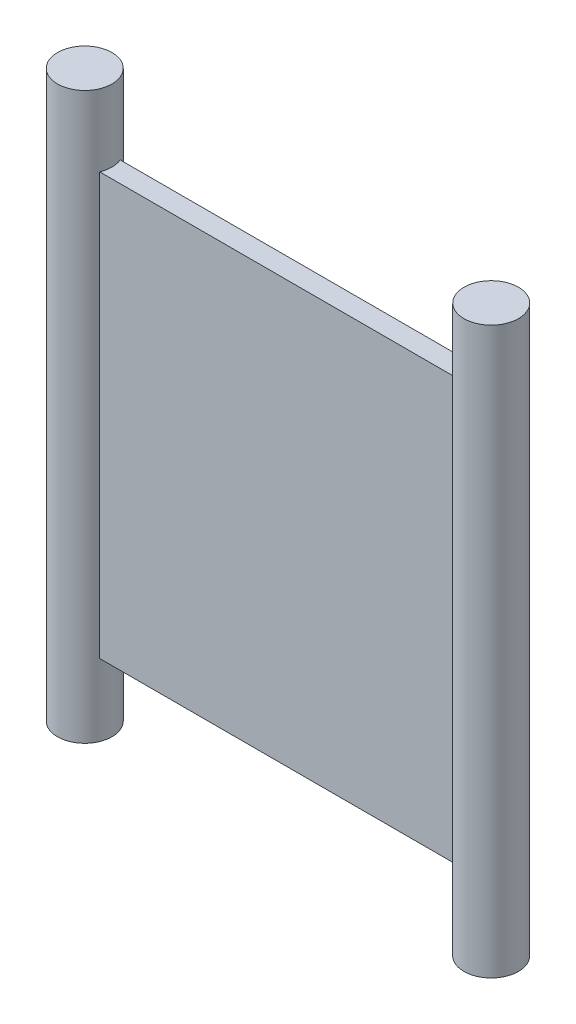
ISO-10303-21;
HEADER;
FILE_DESCRIPTION(('STEP AP214'),'2;1');
FILE_NAME('part.step','',(''),(''),'','','');
FILE_SCHEMA(('AUTOMOTIVE_DESIGN { 1 0 10303 214 1 1 1 1 }'));
ENDSEC;
DATA;
#1=APPLICATION_CONTEXT('core data for automotive mechanical design processes');
#2=APPLICATION_PROTOCOL_DEFINITION('international standard','automotive_design',2000,#1);
#3=PRODUCT_CONTEXT('',#1,'mechanical');
#4=PRODUCT('Part','Part','',(#3));
#5=PRODUCT_RELATED_PRODUCT_CATEGORY('part','',(#4));
#6=PRODUCT_DEFINITION_FORMATION('','',#4);
#7=PRODUCT_DEFINITION_CONTEXT('part definition',#1,'design');
#8=PRODUCT_DEFINITION('design','',#6,#7);
#9=PRODUCT_DEFINITION_SHAPE('','',#8);
#10=(LENGTH_UNIT() NAMED_UNIT(*) SI_UNIT(.MILLI.,.METRE.));
#11=(NAMED_UNIT(*) PLANE_ANGLE_UNIT() SI_UNIT($,.RADIAN.));
#12=(NAMED_UNIT(*) SI_UNIT($,.STERADIAN.) SOLID_ANGLE_UNIT());
#13=UNCERTAINTY_MEASURE_WITH_UNIT(LENGTH_MEASURE(1.E-05),#10,'distance_accuracy_value','');
#14=(GEOMETRIC_REPRESENTATION_CONTEXT(3) GLOBAL_UNCERTAINTY_ASSIGNED_CONTEXT((#13)) GLOBAL_UNIT_ASSIGNED_CONTEXT((#10,
#11,#12)) REPRESENTATION_CONTEXT('',''));
#15=CARTESIAN_POINT('',(0.,0.,0.));
#16=DIRECTION('',(0.,0.,1.));
#17=DIRECTION('',(1.,0.,0.));
#18=AXIS2_PLACEMENT_3D('',#15,#16,#17);
#19=CARTESIAN_POINT('',(9.885,20.5,0.499999999999999));
#20=DIRECTION('',(0.,0.,-1.));
#21=DIRECTION('',(-1.,0.,0.));
#22=AXIS2_PLACEMENT_3D('',#19,#20,#21);
#23=PLANE('',#22);
#24=DIRECTION('',(0.,-1.,0.));
#25=VECTOR('',#24,1.);
#26=CARTESIAN_POINT('',(8.6579608808192,24.,0.499999999999999));
#27=LINE('',#26,#25);
#28=CARTESIAN_POINT('',(8.6579608808192,20.5,0.499999999999999));
#29=VERTEX_POINT('',#28);
#30=CARTESIAN_POINT('',(8.6579608808192,0.,0.499999999999999));
#31=VERTEX_POINT('',#30);
#32=EDGE_CURVE('E53',#29,#31,#27,.T.);
#33=ORIENTED_EDGE('',*,*,#32,.F.);
#34=DIRECTION('',(1.,0.,0.));
#35=VECTOR('',#34,1.);
#36=CARTESIAN_POINT('',(9.885,20.5,0.499999999999999));
#37=LINE('',#36,#35);
#38=CARTESIAN_POINT('',(-8.65796088081919,20.5,0.500000000000001));
#39=VERTEX_POINT('',#38);
#40=EDGE_CURVE('E90',#39,#29,#37,.T.);
#41=ORIENTED_EDGE('',*,*,#40,.F.);
#42=DIRECTION('',(0.,-1.,0.));
#43=VECTOR('',#42,1.);
#44=CARTESIAN_POINT('',(-8.65796088081919,24.,0.500000000000001));
#45=LINE('',#44,#43);
#46=CARTESIAN_POINT('',(-8.65796088081919,0.,0.500000000000001));
#47=VERTEX_POINT('',#46);
#48=EDGE_CURVE('E103',#47,#39,#45,.F.);
#49=ORIENTED_EDGE('',*,*,#48,.F.);
#50=DIRECTION('',(1.,0.,0.));
#51=VECTOR('',#50,1.);
#52=CARTESIAN_POINT('',(9.885,0.,0.499999999999999));
#53=LINE('',#52,#51);
#54=EDGE_CURVE('E91',#47,#31,#53,.T.);
#55=ORIENTED_EDGE('',*,*,#54,.T.);
#56=EDGE_LOOP('',(#33,#41,#49,#55));
#57=FACE_BOUND('',#56,.T.);
#58=ADVANCED_FACE('F39',(#57),#23,.F.);
#59=CARTESIAN_POINT('',(9.885,20.5,-0.500000000000001));
#60=DIRECTION('',(0.,0.,1.));
#61=DIRECTION('',(1.,0.,0.));
#62=AXIS2_PLACEMENT_3D('',#59,#60,#61);
#63=PLANE('',#62);
#64=DIRECTION('',(0.,-1.,0.));
#65=VECTOR('',#64,1.);
#66=CARTESIAN_POINT('',(8.6579608808192,24.,-0.500000000000001));
#67=LINE('',#66,#65);
#68=CARTESIAN_POINT('',(8.6579608808192,0.,-0.500000000000001));
#69=VERTEX_POINT('',#68);
#70=CARTESIAN_POINT('',(8.6579608808192,20.5,-0.500000000000001));
#71=VERTEX_POINT('',#70);
#72=EDGE_CURVE('E78',#69,#71,#67,.F.);
#73=ORIENTED_EDGE('',*,*,#72,.F.);
#74=DIRECTION('',(-1.,0.,0.));
#75=VECTOR('',#74,1.);
#76=CARTESIAN_POINT('',(9.885,0.,-0.500000000000001));
#77=LINE('',#76,#75);
#78=CARTESIAN_POINT('',(-8.65796088081919,0.,-0.499999999999999));
#79=VERTEX_POINT('',#78);
#80=EDGE_CURVE('E60',#69,#79,#77,.T.);
#81=ORIENTED_EDGE('',*,*,#80,.T.);
#82=DIRECTION('',(0.,-1.,0.));
#83=VECTOR('',#82,1.);
#84=CARTESIAN_POINT('',(-8.65796088081919,24.,-0.499999999999999));
#85=LINE('',#84,#83);
#86=CARTESIAN_POINT('',(-8.65796088081919,20.5,-0.499999999999999));
#87=VERTEX_POINT('',#86);
#88=EDGE_CURVE('E105',#87,#79,#85,.T.);
#89=ORIENTED_EDGE('',*,*,#88,.F.);
#90=DIRECTION('',(-1.,0.,0.));
#91=VECTOR('',#90,1.);
#92=CARTESIAN_POINT('',(9.885,20.5,-0.500000000000001));
#93=LINE('',#92,#91);
#94=EDGE_CURVE('E85',#71,#87,#93,.T.);
#95=ORIENTED_EDGE('',*,*,#94,.F.);
#96=EDGE_LOOP('',(#73,#81,#89,#95));
#97=FACE_BOUND('',#96,.T.);
#98=ADVANCED_FACE('F84',(#97),#63,.F.);
#99=CARTESIAN_POINT('',(-9.885,24.,0.));
#100=DIRECTION('',(0.,-1.,0.));
#101=DIRECTION('',(0.,0.,-1.));
#102=AXIS2_PLACEMENT_3D('',#99,#100,#101);
#103=CYLINDRICAL_SURFACE('',#102,1.325);
#104=CARTESIAN_POINT('',(-9.885,24.,0.));
#105=DIRECTION('',(0.,1.,0.));
#106=DIRECTION('',(0.,0.,1.));
#107=AXIS2_PLACEMENT_3D('',#104,#105,#106);
#108=CIRCLE('',#107,1.325);
#109=CARTESIAN_POINT('',(-9.885,24.,1.325));
#110=VERTEX_POINT('',#109);
#111=EDGE_CURVE('E107',#110,#110,#108,.T.);
#112=ORIENTED_EDGE('',*,*,#111,.F.);
#113=EDGE_LOOP('',(#112));
#114=FACE_BOUND('',#113,.T.);
#115=CARTESIAN_POINT('',(-9.885,-3.5,0.));
#116=DIRECTION('',(0.,1.,0.));
#117=DIRECTION('',(0.,0.,1.));
#118=AXIS2_PLACEMENT_3D('',#115,#116,#117);
#119=CIRCLE('',#118,1.325);
#120=CARTESIAN_POINT('',(-9.885,-3.5,1.325));
#121=VERTEX_POINT('',#120);
#122=EDGE_CURVE('E108',#121,#121,#119,.T.);
#123=ORIENTED_EDGE('',*,*,#122,.T.);
#124=EDGE_LOOP('',(#123));
#125=FACE_BOUND('',#124,.T.);
#126=ORIENTED_EDGE('',*,*,#48,.T.);
#127=CARTESIAN_POINT('',(-9.885,20.5,0.));
#128=DIRECTION('',(0.,-1.,0.));
#129=DIRECTION('',(0.,0.,-1.));
#130=AXIS2_PLACEMENT_3D('',#127,#128,#129);
#131=CIRCLE('',#130,1.325);
#132=EDGE_CURVE('E95',#39,#87,#131,.F.);
#133=ORIENTED_EDGE('',*,*,#132,.T.);
#134=ORIENTED_EDGE('',*,*,#88,.T.);
#135=CARTESIAN_POINT('',(-9.885,0.,0.));
#136=DIRECTION('',(0.,-1.,0.));
#137=DIRECTION('',(0.,0.,-1.));
#138=AXIS2_PLACEMENT_3D('',#135,#136,#137);
#139=CIRCLE('',#138,1.325);
#140=EDGE_CURVE('E46',#47,#79,#139,.F.);
#141=ORIENTED_EDGE('',*,*,#140,.F.);
#142=EDGE_LOOP('',(#126,#133,#134,#141));
#143=FACE_BOUND('',#142,.T.);
#144=ADVANCED_FACE('F138',(#114,#125,#143),#103,.T.);
#145=CARTESIAN_POINT('',(-9.885,24.,0.));
#146=DIRECTION('',(0.,1.,0.));
#147=DIRECTION('',(0.,0.,1.));
#148=AXIS2_PLACEMENT_3D('',#145,#146,#147);
#149=PLANE('',#148);
#150=ORIENTED_EDGE('',*,*,#111,.T.);
#151=EDGE_LOOP('',(#150));
#152=FACE_BOUND('',#151,.T.);
#153=ADVANCED_FACE('F144',(#152),#149,.T.);
#154=CARTESIAN_POINT('',(-9.885,-3.5,0.));
#155=DIRECTION('',(0.,1.,0.));
#156=DIRECTION('',(0.,0.,1.));
#157=AXIS2_PLACEMENT_3D('',#154,#155,#156);
#158=PLANE('',#157);
#159=ORIENTED_EDGE('',*,*,#122,.F.);
#160=EDGE_LOOP('',(#159));
#161=FACE_BOUND('',#160,.T.);
#162=ADVANCED_FACE('F150',(#161),#158,.F.);
#163=CARTESIAN_POINT('',(0.,20.5,0.));
#164=DIRECTION('',(0.,-1.,0.));
#165=DIRECTION('',(0.,0.,-1.));
#166=AXIS2_PLACEMENT_3D('',#163,#164,#165);
#167=PLANE('',#166);
#168=CARTESIAN_POINT('',(9.885,20.5,0.));
#169=DIRECTION('',(0.,-1.,0.));
#170=DIRECTION('',(0.,0.,-1.));
#171=AXIS2_PLACEMENT_3D('',#168,#169,#170);
#172=CIRCLE('',#171,1.325);
#173=EDGE_CURVE('E111',#71,#29,#172,.F.);
#174=ORIENTED_EDGE('',*,*,#173,.F.);
#175=ORIENTED_EDGE('',*,*,#94,.T.);
#176=ORIENTED_EDGE('',*,*,#132,.F.);
#177=ORIENTED_EDGE('',*,*,#40,.T.);
#178=EDGE_LOOP('',(#174,#175,#176,#177));
#179=FACE_BOUND('',#178,.T.);
#180=ADVANCED_FACE('F141',(#179),#167,.F.);
#181=CARTESIAN_POINT('',(0.,0.,0.));
#182=DIRECTION('',(0.,-1.,0.));
#183=DIRECTION('',(0.,0.,-1.));
#184=AXIS2_PLACEMENT_3D('',#181,#182,#183);
#185=PLANE('',#184);
#186=ORIENTED_EDGE('',*,*,#80,.F.);
#187=CARTESIAN_POINT('',(9.885,0.,0.));
#188=DIRECTION('',(0.,-1.,0.));
#189=DIRECTION('',(0.,0.,-1.));
#190=AXIS2_PLACEMENT_3D('',#187,#188,#189);
#191=CIRCLE('',#190,1.325);
#192=EDGE_CURVE('E11',#69,#31,#191,.F.);
#193=ORIENTED_EDGE('',*,*,#192,.T.);
#194=ORIENTED_EDGE('',*,*,#54,.F.);
#195=ORIENTED_EDGE('',*,*,#140,.T.);
#196=EDGE_LOOP('',(#186,#193,#194,#195));
#197=FACE_BOUND('',#196,.T.);
#198=ADVANCED_FACE('F89',(#197),#185,.T.);
#199=CARTESIAN_POINT('',(9.885,24.,0.));
#200=DIRECTION('',(0.,-1.,0.));
#201=DIRECTION('',(0.,0.,-1.));
#202=AXIS2_PLACEMENT_3D('',#199,#200,#201);
#203=CYLINDRICAL_SURFACE('',#202,1.325);
#204=CARTESIAN_POINT('',(9.885,24.,0.));
#205=DIRECTION('',(0.,1.,0.));
#206=DIRECTION('',(0.,0.,1.));
#207=AXIS2_PLACEMENT_3D('',#204,#205,#206);
#208=CIRCLE('',#207,1.325);
#209=CARTESIAN_POINT('',(9.885,24.,1.325));
#210=VERTEX_POINT('',#209);
#211=EDGE_CURVE('E116',#210,#210,#208,.T.);
#212=ORIENTED_EDGE('',*,*,#211,.F.);
#213=EDGE_LOOP('',(#212));
#214=FACE_BOUND('',#213,.T.);
#215=CARTESIAN_POINT('',(9.885,-3.5,0.));
#216=DIRECTION('',(0.,1.,0.));
#217=DIRECTION('',(0.,0.,1.));
#218=AXIS2_PLACEMENT_3D('',#215,#216,#217);
#219=CIRCLE('',#218,1.325);
#220=CARTESIAN_POINT('',(9.885,-3.5,1.325));
#221=VERTEX_POINT('',#220);
#222=EDGE_CURVE('E86',#221,#221,#219,.T.);
#223=ORIENTED_EDGE('',*,*,#222,.T.);
#224=EDGE_LOOP('',(#223));
#225=FACE_BOUND('',#224,.T.);
#226=ORIENTED_EDGE('',*,*,#72,.T.);
#227=ORIENTED_EDGE('',*,*,#173,.T.);
#228=ORIENTED_EDGE('',*,*,#32,.T.);
#229=ORIENTED_EDGE('',*,*,#192,.F.);
#230=EDGE_LOOP('',(#226,#227,#228,#229));
#231=FACE_BOUND('',#230,.T.);
#232=ADVANCED_FACE('F77',(#214,#225,#231),#203,.T.);
#233=CARTESIAN_POINT('',(9.885,24.,0.));
#234=DIRECTION('',(0.,1.,0.));
#235=DIRECTION('',(0.,0.,1.));
#236=AXIS2_PLACEMENT_3D('',#233,#234,#235);
#237=PLANE('',#236);
#238=ORIENTED_EDGE('',*,*,#211,.T.);
#239=EDGE_LOOP('',(#238));
#240=FACE_BOUND('',#239,.T.);
#241=ADVANCED_FACE('F125',(#240),#237,.T.);
#242=CARTESIAN_POINT('',(9.885,-3.5,0.));
#243=DIRECTION('',(0.,1.,0.));
#244=DIRECTION('',(0.,0.,1.));
#245=AXIS2_PLACEMENT_3D('',#242,#243,#244);
#246=PLANE('',#245);
#247=ORIENTED_EDGE('',*,*,#222,.F.);
#248=EDGE_LOOP('',(#247));
#249=FACE_BOUND('',#248,.T.);
#250=ADVANCED_FACE('F123',(#249),#246,.F.);
#251=CLOSED_SHELL('',(#58,#98,#144,#153,#162,#180,#198,#232,#241,#250));
#252=MANIFOLD_SOLID_BREP('B2',#251);
#253=ADVANCED_BREP_SHAPE_REPRESENTATION('',(#18,#252),#14);
#254=SHAPE_DEFINITION_REPRESENTATION(#9,#253);
ENDSEC;
END-ISO-10303-21;
